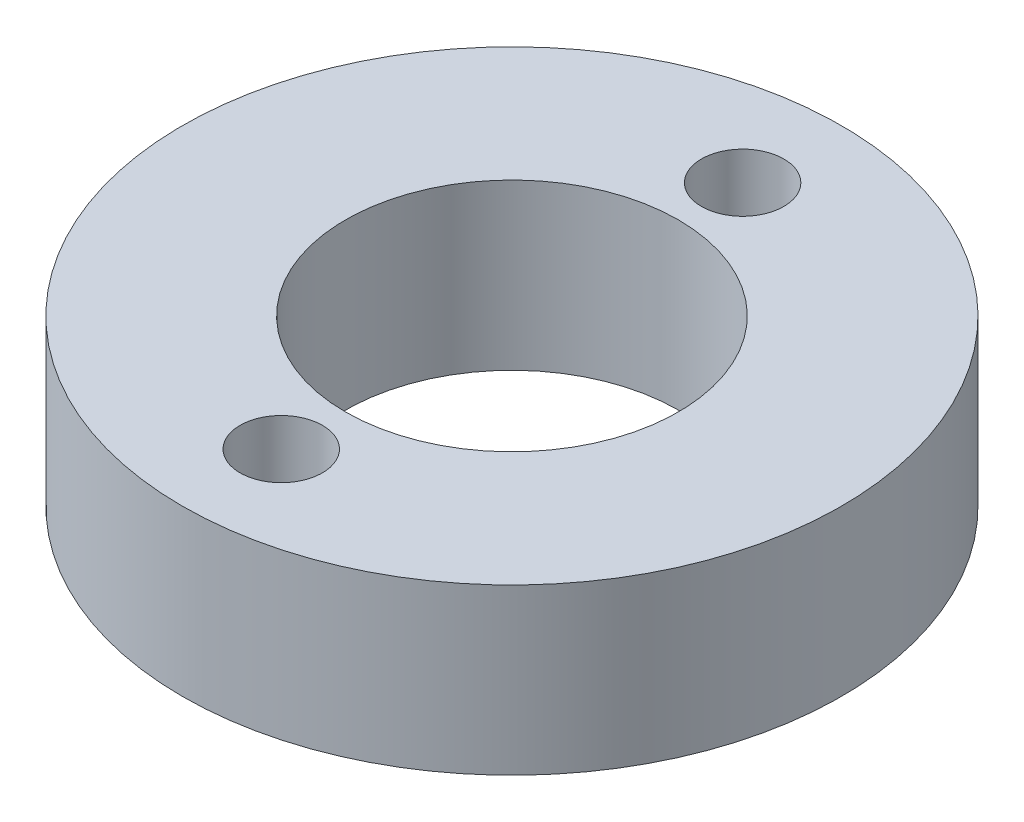
ISO-10303-21;
HEADER;
FILE_DESCRIPTION(('STEP AP214'),'2;1');
FILE_NAME('part.step','',(''),(''),'','','');
FILE_SCHEMA(('AUTOMOTIVE_DESIGN { 1 0 10303 214 1 1 1 1 }'));
ENDSEC;
DATA;
#1=APPLICATION_CONTEXT('core data for automotive mechanical design processes');
#2=APPLICATION_PROTOCOL_DEFINITION('international standard','automotive_design',2000,#1);
#3=PRODUCT_CONTEXT('',#1,'mechanical');
#4=PRODUCT('Part','Part','',(#3));
#5=PRODUCT_RELATED_PRODUCT_CATEGORY('part','',(#4));
#6=PRODUCT_DEFINITION_FORMATION('','',#4);
#7=PRODUCT_DEFINITION_CONTEXT('part definition',#1,'design');
#8=PRODUCT_DEFINITION('design','',#6,#7);
#9=PRODUCT_DEFINITION_SHAPE('','',#8);
#10=(LENGTH_UNIT() NAMED_UNIT(*) SI_UNIT(.MILLI.,.METRE.));
#11=(NAMED_UNIT(*) PLANE_ANGLE_UNIT() SI_UNIT($,.RADIAN.));
#12=(NAMED_UNIT(*) SI_UNIT($,.STERADIAN.) SOLID_ANGLE_UNIT());
#13=UNCERTAINTY_MEASURE_WITH_UNIT(LENGTH_MEASURE(1.E-05),#10,'distance_accuracy_value','');
#14=(GEOMETRIC_REPRESENTATION_CONTEXT(3) GLOBAL_UNCERTAINTY_ASSIGNED_CONTEXT((#13)) GLOBAL_UNIT_ASSIGNED_CONTEXT((#10,
#11,#12)) REPRESENTATION_CONTEXT('',''));
#15=CARTESIAN_POINT('',(0.,0.,0.));
#16=DIRECTION('',(0.,0.,1.));
#17=DIRECTION('',(1.,0.,0.));
#18=AXIS2_PLACEMENT_3D('',#15,#16,#17);
#19=CARTESIAN_POINT('',(0.,5.,0.));
#20=DIRECTION('',(0.,1.,0.));
#21=DIRECTION('',(0.,0.,1.));
#22=AXIS2_PLACEMENT_3D('',#19,#20,#21);
#23=PLANE('',#22);
#24=CARTESIAN_POINT('',(0.,5.,7.));
#25=DIRECTION('',(0.,1.,0.));
#26=DIRECTION('',(0.,0.,-1.));
#27=AXIS2_PLACEMENT_3D('',#24,#25,#26);
#28=CIRCLE('',#27,1.25);
#29=CARTESIAN_POINT('',(0.,5.,5.75));
#30=VERTEX_POINT('',#29);
#31=EDGE_CURVE('E62',#30,#30,#28,.T.);
#32=ORIENTED_EDGE('',*,*,#31,.F.);
#33=EDGE_LOOP('',(#32));
#34=FACE_BOUND('',#33,.T.);
#35=CARTESIAN_POINT('',(0.,5.,-7.));
#36=DIRECTION('',(0.,1.,0.));
#37=DIRECTION('',(0.,0.,1.));
#38=AXIS2_PLACEMENT_3D('',#35,#36,#37);
#39=CIRCLE('',#38,1.25);
#40=CARTESIAN_POINT('',(0.,5.,-5.75));
#41=VERTEX_POINT('',#40);
#42=EDGE_CURVE('E56',#41,#41,#39,.T.);
#43=ORIENTED_EDGE('',*,*,#42,.F.);
#44=EDGE_LOOP('',(#43));
#45=FACE_BOUND('',#44,.T.);
#46=CARTESIAN_POINT('',(0.,5.,0.));
#47=DIRECTION('',(0.,1.,0.));
#48=DIRECTION('',(0.,0.,1.));
#49=AXIS2_PLACEMENT_3D('',#46,#47,#48);
#50=CIRCLE('',#49,10.);
#51=CARTESIAN_POINT('',(0.,5.,10.));
#52=VERTEX_POINT('',#51);
#53=EDGE_CURVE('E10',#52,#52,#50,.T.);
#54=ORIENTED_EDGE('',*,*,#53,.T.);
#55=EDGE_LOOP('',(#54));
#56=FACE_BOUND('',#55,.T.);
#57=CARTESIAN_POINT('',(0.,5.,0.));
#58=DIRECTION('',(0.,1.,0.));
#59=DIRECTION('',(0.,0.,1.));
#60=AXIS2_PLACEMENT_3D('',#57,#58,#59);
#61=CIRCLE('',#60,5.05);
#62=CARTESIAN_POINT('',(0.,5.,5.05));
#63=VERTEX_POINT('',#62);
#64=EDGE_CURVE('E48',#63,#63,#61,.T.);
#65=ORIENTED_EDGE('',*,*,#64,.F.);
#66=EDGE_LOOP('',(#65));
#67=FACE_BOUND('',#66,.T.);
#68=ADVANCED_FACE('F37',(#34,#45,#56,#67),#23,.T.);
#69=CARTESIAN_POINT('',(0.,0.,0.));
#70=DIRECTION('',(0.,1.,0.));
#71=DIRECTION('',(0.,0.,1.));
#72=AXIS2_PLACEMENT_3D('',#69,#70,#71);
#73=PLANE('',#72);
#74=CARTESIAN_POINT('',(0.,0.,0.));
#75=DIRECTION('',(0.,1.,0.));
#76=DIRECTION('',(0.,0.,1.));
#77=AXIS2_PLACEMENT_3D('',#74,#75,#76);
#78=CIRCLE('',#77,10.);
#79=CARTESIAN_POINT('',(0.,0.,10.));
#80=VERTEX_POINT('',#79);
#81=EDGE_CURVE('E41',#80,#80,#78,.T.);
#82=ORIENTED_EDGE('',*,*,#81,.F.);
#83=EDGE_LOOP('',(#82));
#84=FACE_BOUND('',#83,.T.);
#85=CARTESIAN_POINT('',(0.,0.,0.));
#86=DIRECTION('',(0.,1.,0.));
#87=DIRECTION('',(0.,0.,1.));
#88=AXIS2_PLACEMENT_3D('',#85,#86,#87);
#89=CIRCLE('',#88,5.05);
#90=CARTESIAN_POINT('',(0.,0.,5.05));
#91=VERTEX_POINT('',#90);
#92=EDGE_CURVE('E50',#91,#91,#89,.T.);
#93=ORIENTED_EDGE('',*,*,#92,.T.);
#94=EDGE_LOOP('',(#93));
#95=FACE_BOUND('',#94,.T.);
#96=ADVANCED_FACE('F79',(#84,#95),#73,.F.);
#97=CARTESIAN_POINT('',(0.,5.,0.));
#98=DIRECTION('',(0.,-1.,0.));
#99=DIRECTION('',(0.,0.,-1.));
#100=AXIS2_PLACEMENT_3D('',#97,#98,#99);
#101=CYLINDRICAL_SURFACE('',#100,10.);
#102=ORIENTED_EDGE('',*,*,#53,.F.);
#103=EDGE_LOOP('',(#102));
#104=FACE_BOUND('',#103,.T.);
#105=ORIENTED_EDGE('',*,*,#81,.T.);
#106=EDGE_LOOP('',(#105));
#107=FACE_BOUND('',#106,.T.);
#108=ADVANCED_FACE('F39',(#104,#107),#101,.T.);
#109=CARTESIAN_POINT('',(0.,5.,0.));
#110=DIRECTION('',(0.,-1.,0.));
#111=DIRECTION('',(0.,0.,-1.));
#112=AXIS2_PLACEMENT_3D('',#109,#110,#111);
#113=CYLINDRICAL_SURFACE('',#112,5.05);
#114=ORIENTED_EDGE('',*,*,#64,.T.);
#115=EDGE_LOOP('',(#114));
#116=FACE_BOUND('',#115,.T.);
#117=ORIENTED_EDGE('',*,*,#92,.F.);
#118=EDGE_LOOP('',(#117));
#119=FACE_BOUND('',#118,.T.);
#120=ADVANCED_FACE('F85',(#116,#119),#113,.F.);
#121=CARTESIAN_POINT('',(0.,2.5,-7.));
#122=DIRECTION('',(0.,1.,0.));
#123=DIRECTION('',(0.,0.,1.));
#124=AXIS2_PLACEMENT_3D('',#121,#122,#123);
#125=CYLINDRICAL_SURFACE('',#124,1.25);
#126=CARTESIAN_POINT('',(0.,2.5,-7.));
#127=DIRECTION('',(0.,1.,0.));
#128=DIRECTION('',(0.,0.,1.));
#129=AXIS2_PLACEMENT_3D('',#126,#127,#128);
#130=CIRCLE('',#129,1.25);
#131=CARTESIAN_POINT('',(0.,2.5,-5.75));
#132=VERTEX_POINT('',#131);
#133=EDGE_CURVE('E53',#132,#132,#130,.T.);
#134=ORIENTED_EDGE('',*,*,#133,.F.);
#135=EDGE_LOOP('',(#134));
#136=FACE_BOUND('',#135,.T.);
#137=ORIENTED_EDGE('',*,*,#42,.T.);
#138=EDGE_LOOP('',(#137));
#139=FACE_BOUND('',#138,.T.);
#140=ADVANCED_FACE('F88',(#136,#139),#125,.F.);
#141=CARTESIAN_POINT('',(0.,2.5,-7.));
#142=DIRECTION('',(0.,1.,0.));
#143=DIRECTION('',(0.,0.,1.));
#144=AXIS2_PLACEMENT_3D('',#141,#142,#143);
#145=PLANE('',#144);
#146=ORIENTED_EDGE('',*,*,#133,.T.);
#147=EDGE_LOOP('',(#146));
#148=FACE_BOUND('',#147,.T.);
#149=ADVANCED_FACE('F73',(#148),#145,.T.);
#150=CARTESIAN_POINT('',(0.,2.5,7.));
#151=DIRECTION('',(0.,1.,0.));
#152=DIRECTION('',(0.,0.,1.));
#153=AXIS2_PLACEMENT_3D('',#150,#151,#152);
#154=CYLINDRICAL_SURFACE('',#153,1.25);
#155=CARTESIAN_POINT('',(0.,2.5,7.));
#156=DIRECTION('',(0.,1.,0.));
#157=DIRECTION('',(0.,0.,-1.));
#158=AXIS2_PLACEMENT_3D('',#155,#156,#157);
#159=CIRCLE('',#158,1.25);
#160=CARTESIAN_POINT('',(0.,2.5,5.75));
#161=VERTEX_POINT('',#160);
#162=EDGE_CURVE('E59',#161,#161,#159,.T.);
#163=ORIENTED_EDGE('',*,*,#162,.F.);
#164=EDGE_LOOP('',(#163));
#165=FACE_BOUND('',#164,.T.);
#166=ORIENTED_EDGE('',*,*,#31,.T.);
#167=EDGE_LOOP('',(#166));
#168=FACE_BOUND('',#167,.T.);
#169=ADVANCED_FACE('F70',(#165,#168),#154,.F.);
#170=CARTESIAN_POINT('',(0.,2.5,7.));
#171=DIRECTION('',(0.,1.,0.));
#172=DIRECTION('',(0.,0.,-1.));
#173=AXIS2_PLACEMENT_3D('',#170,#171,#172);
#174=PLANE('',#173);
#175=ORIENTED_EDGE('',*,*,#162,.T.);
#176=EDGE_LOOP('',(#175));
#177=FACE_BOUND('',#176,.T.);
#178=ADVANCED_FACE('F68',(#177),#174,.T.);
#179=CLOSED_SHELL('',(#68,#96,#108,#120,#140,#149,#169,#178));
#180=MANIFOLD_SOLID_BREP('B2',#179);
#181=ADVANCED_BREP_SHAPE_REPRESENTATION('',(#18,#180),#14);
#182=SHAPE_DEFINITION_REPRESENTATION(#9,#181);
ENDSEC;
END-ISO-10303-21;
